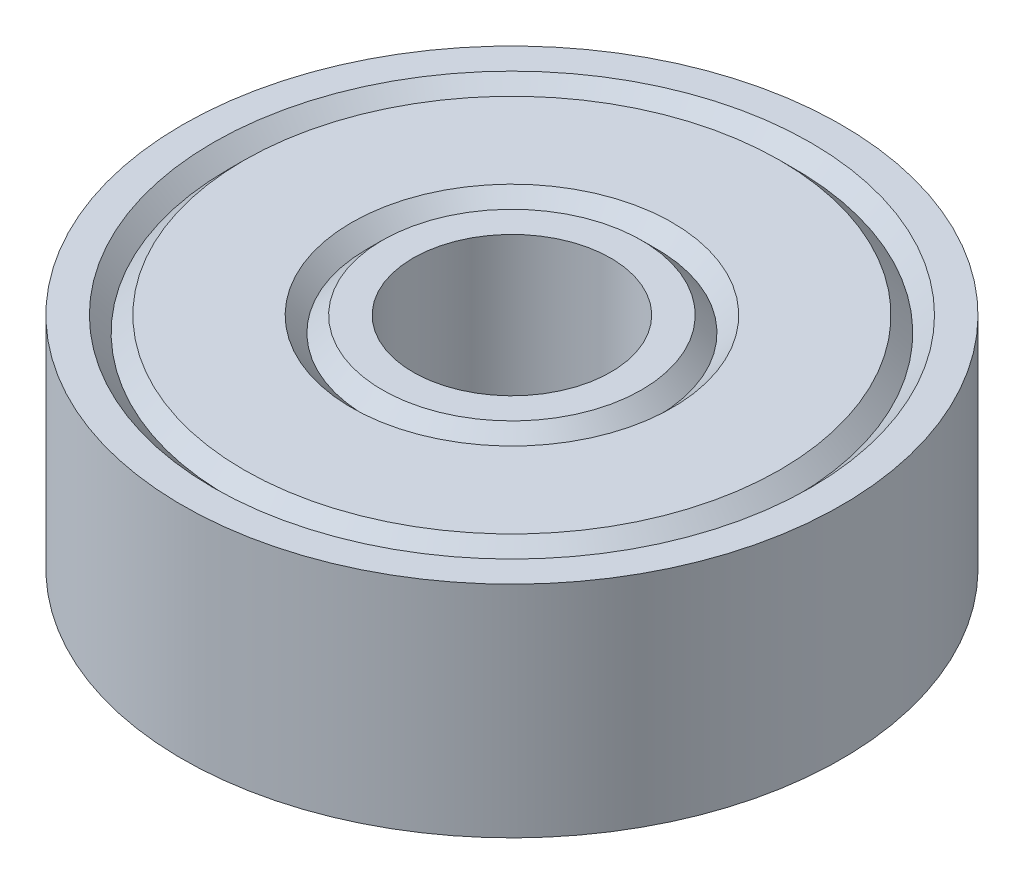
ISO-10303-21;
HEADER;
FILE_DESCRIPTION(('STEP AP214'),'2;1');
FILE_NAME('part.step','',(''),(''),'','','');
FILE_SCHEMA(('AUTOMOTIVE_DESIGN { 1 0 10303 214 1 1 1 1 }'));
ENDSEC;
DATA;
#1=APPLICATION_CONTEXT('core data for automotive mechanical design processes');
#2=APPLICATION_PROTOCOL_DEFINITION('international standard','automotive_design',2000,#1);
#3=PRODUCT_CONTEXT('',#1,'mechanical');
#4=PRODUCT('Part','Part','',(#3));
#5=PRODUCT_RELATED_PRODUCT_CATEGORY('part','',(#4));
#6=PRODUCT_DEFINITION_FORMATION('','',#4);
#7=PRODUCT_DEFINITION_CONTEXT('part definition',#1,'design');
#8=PRODUCT_DEFINITION('design','',#6,#7);
#9=PRODUCT_DEFINITION_SHAPE('','',#8);
#10=(LENGTH_UNIT() NAMED_UNIT(*) SI_UNIT(.MILLI.,.METRE.));
#11=(NAMED_UNIT(*) PLANE_ANGLE_UNIT() SI_UNIT($,.RADIAN.));
#12=(NAMED_UNIT(*) SI_UNIT($,.STERADIAN.) SOLID_ANGLE_UNIT());
#13=UNCERTAINTY_MEASURE_WITH_UNIT(LENGTH_MEASURE(1.E-05),#10,'distance_accuracy_value','');
#14=(GEOMETRIC_REPRESENTATION_CONTEXT(3) GLOBAL_UNCERTAINTY_ASSIGNED_CONTEXT((#13)) GLOBAL_UNIT_ASSIGNED_CONTEXT((#10,
#11,#12)) REPRESENTATION_CONTEXT('',''));
#15=CARTESIAN_POINT('',(0.,0.,0.));
#16=DIRECTION('',(0.,0.,1.));
#17=DIRECTION('',(1.,0.,0.));
#18=AXIS2_PLACEMENT_3D('',#15,#16,#17);
#19=CARTESIAN_POINT('',(0.,5.,0.));
#20=DIRECTION('',(0.,1.,0.));
#21=DIRECTION('',(-1.,0.,0.));
#22=AXIS2_PLACEMENT_3D('',#19,#20,#21);
#23=CYLINDRICAL_SURFACE('',#22,4.5);
#24=CARTESIAN_POINT('',(0.,5.00000000000001,0.));
#25=DIRECTION('',(0.,1.,0.));
#26=DIRECTION('',(-1.,0.,0.));
#27=AXIS2_PLACEMENT_3D('',#24,#25,#26);
#28=CIRCLE('',#27,4.5);
#29=CARTESIAN_POINT('',(-4.5,5.00000000000001,0.));
#30=VERTEX_POINT('',#29);
#31=EDGE_CURVE('E83',#30,#30,#28,.T.);
#32=ORIENTED_EDGE('',*,*,#31,.T.);
#33=EDGE_LOOP('',(#32));
#34=FACE_BOUND('',#33,.T.);
#35=CARTESIAN_POINT('',(0.,-5.00000000000001,0.));
#36=DIRECTION('',(0.,1.,0.));
#37=DIRECTION('',(-1.,0.,0.));
#38=AXIS2_PLACEMENT_3D('',#35,#36,#37);
#39=CIRCLE('',#38,4.5);
#40=CARTESIAN_POINT('',(-4.5,-5.00000000000001,0.));
#41=VERTEX_POINT('',#40);
#42=EDGE_CURVE('E10',#41,#41,#39,.T.);
#43=ORIENTED_EDGE('',*,*,#42,.F.);
#44=EDGE_LOOP('',(#43));
#45=FACE_BOUND('',#44,.T.);
#46=ADVANCED_FACE('F31',(#34,#45),#23,.F.);
#47=CARTESIAN_POINT('',(-4.5,-5.,0.));
#48=DIRECTION('',(0.,-1.,0.));
#49=DIRECTION('',(1.,0.,0.));
#50=AXIS2_PLACEMENT_3D('',#47,#48,#49);
#51=PLANE('',#50);
#52=ORIENTED_EDGE('',*,*,#42,.T.);
#53=EDGE_LOOP('',(#52));
#54=FACE_BOUND('',#53,.T.);
#55=CARTESIAN_POINT('',(0.,-5.,0.));
#56=DIRECTION('',(0.,1.,0.));
#57=DIRECTION('',(-1.,0.,0.));
#58=AXIS2_PLACEMENT_3D('',#55,#56,#57);
#59=CIRCLE('',#58,5.9);
#60=CARTESIAN_POINT('',(-5.9,-5.,0.));
#61=VERTEX_POINT('',#60);
#62=EDGE_CURVE('E37',#61,#61,#59,.T.);
#63=ORIENTED_EDGE('',*,*,#62,.F.);
#64=EDGE_LOOP('',(#63));
#65=FACE_BOUND('',#64,.T.);
#66=ADVANCED_FACE('F101',(#54,#65),#51,.T.);
#67=CARTESIAN_POINT('',(0.,-4.3,0.));
#68=DIRECTION('',(0.,1.,0.));
#69=DIRECTION('',(-1.,0.,0.));
#70=AXIS2_PLACEMENT_3D('',#67,#68,#69);
#71=CONICAL_SURFACE('',#70,6.59999999999999,0.78539816339745);
#72=ORIENTED_EDGE('',*,*,#62,.T.);
#73=EDGE_LOOP('',(#72));
#74=FACE_BOUND('',#73,.T.);
#75=CARTESIAN_POINT('',(0.,-4.3,0.));
#76=DIRECTION('',(0.,1.,0.));
#77=DIRECTION('',(-1.,0.,0.));
#78=AXIS2_PLACEMENT_3D('',#75,#76,#77);
#79=CIRCLE('',#78,6.59999999999999);
#80=CARTESIAN_POINT('',(-6.59999999999999,-4.3,0.));
#81=VERTEX_POINT('',#80);
#82=EDGE_CURVE('E41',#81,#81,#79,.T.);
#83=ORIENTED_EDGE('',*,*,#82,.F.);
#84=EDGE_LOOP('',(#83));
#85=FACE_BOUND('',#84,.T.);
#86=ADVANCED_FACE('F105',(#74,#85),#71,.T.);
#87=CARTESIAN_POINT('',(0.,-5.,0.));
#88=DIRECTION('',(0.,-1.,0.));
#89=DIRECTION('',(1.,0.,0.));
#90=AXIS2_PLACEMENT_3D('',#87,#88,#89);
#91=CONICAL_SURFACE('',#90,7.29999999999999,0.785398163397449);
#92=ORIENTED_EDGE('',*,*,#82,.T.);
#93=EDGE_LOOP('',(#92));
#94=FACE_BOUND('',#93,.T.);
#95=CARTESIAN_POINT('',(0.,-5.,0.));
#96=DIRECTION('',(0.,1.,0.));
#97=DIRECTION('',(-1.,0.,0.));
#98=AXIS2_PLACEMENT_3D('',#95,#96,#97);
#99=CIRCLE('',#98,7.29999999999999);
#100=CARTESIAN_POINT('',(-7.29999999999999,-5.,0.));
#101=VERTEX_POINT('',#100);
#102=EDGE_CURVE('E45',#101,#101,#99,.T.);
#103=ORIENTED_EDGE('',*,*,#102,.F.);
#104=EDGE_LOOP('',(#103));
#105=FACE_BOUND('',#104,.T.);
#106=ADVANCED_FACE('F109',(#94,#105),#91,.F.);
#107=CARTESIAN_POINT('',(-7.29999999999999,-5.,0.));
#108=DIRECTION('',(0.,-1.,0.));
#109=DIRECTION('',(1.,0.,0.));
#110=AXIS2_PLACEMENT_3D('',#107,#108,#109);
#111=PLANE('',#110);
#112=ORIENTED_EDGE('',*,*,#102,.T.);
#113=EDGE_LOOP('',(#112));
#114=FACE_BOUND('',#113,.T.);
#115=CARTESIAN_POINT('',(0.,-5.,0.));
#116=DIRECTION('',(0.,1.,0.));
#117=DIRECTION('',(-1.,0.,0.));
#118=AXIS2_PLACEMENT_3D('',#115,#116,#117);
#119=CIRCLE('',#118,12.2);
#120=CARTESIAN_POINT('',(-12.2,-5.,0.));
#121=VERTEX_POINT('',#120);
#122=EDGE_CURVE('E50',#121,#121,#119,.T.);
#123=ORIENTED_EDGE('',*,*,#122,.F.);
#124=EDGE_LOOP('',(#123));
#125=FACE_BOUND('',#124,.T.);
#126=ADVANCED_FACE('F115',(#114,#125),#111,.T.);
#127=CARTESIAN_POINT('',(0.,-4.3,0.));
#128=DIRECTION('',(0.,1.,0.));
#129=DIRECTION('',(-1.,0.,0.));
#130=AXIS2_PLACEMENT_3D('',#127,#128,#129);
#131=CONICAL_SURFACE('',#130,12.9,0.785398163397448);
#132=ORIENTED_EDGE('',*,*,#122,.T.);
#133=EDGE_LOOP('',(#132));
#134=FACE_BOUND('',#133,.T.);
#135=CARTESIAN_POINT('',(0.,-4.3,0.));
#136=DIRECTION('',(0.,1.,0.));
#137=DIRECTION('',(-1.,0.,0.));
#138=AXIS2_PLACEMENT_3D('',#135,#136,#137);
#139=CIRCLE('',#138,12.9);
#140=CARTESIAN_POINT('',(-12.9,-4.3,0.));
#141=VERTEX_POINT('',#140);
#142=EDGE_CURVE('E53',#141,#141,#139,.T.);
#143=ORIENTED_EDGE('',*,*,#142,.F.);
#144=EDGE_LOOP('',(#143));
#145=FACE_BOUND('',#144,.T.);
#146=ADVANCED_FACE('F119',(#134,#145),#131,.T.);
#147=CARTESIAN_POINT('',(0.,-5.,0.));
#148=DIRECTION('',(0.,-1.,0.));
#149=DIRECTION('',(1.,0.,0.));
#150=AXIS2_PLACEMENT_3D('',#147,#148,#149);
#151=CONICAL_SURFACE('',#150,13.6,0.785398163397445);
#152=ORIENTED_EDGE('',*,*,#142,.T.);
#153=EDGE_LOOP('',(#152));
#154=FACE_BOUND('',#153,.T.);
#155=CARTESIAN_POINT('',(0.,-5.,0.));
#156=DIRECTION('',(0.,1.,0.));
#157=DIRECTION('',(-1.,0.,0.));
#158=AXIS2_PLACEMENT_3D('',#155,#156,#157);
#159=CIRCLE('',#158,13.6);
#160=CARTESIAN_POINT('',(-13.6,-5.,0.));
#161=VERTEX_POINT('',#160);
#162=EDGE_CURVE('E56',#161,#161,#159,.T.);
#163=ORIENTED_EDGE('',*,*,#162,.F.);
#164=EDGE_LOOP('',(#163));
#165=FACE_BOUND('',#164,.T.);
#166=ADVANCED_FACE('F123',(#154,#165),#151,.F.);
#167=CARTESIAN_POINT('',(-13.6,-5.,0.));
#168=DIRECTION('',(0.,-1.,0.));
#169=DIRECTION('',(1.,0.,0.));
#170=AXIS2_PLACEMENT_3D('',#167,#168,#169);
#171=PLANE('',#170);
#172=ORIENTED_EDGE('',*,*,#162,.T.);
#173=EDGE_LOOP('',(#172));
#174=FACE_BOUND('',#173,.T.);
#175=CARTESIAN_POINT('',(0.,-5.,0.));
#176=DIRECTION('',(0.,1.,0.));
#177=DIRECTION('',(-1.,0.,0.));
#178=AXIS2_PLACEMENT_3D('',#175,#176,#177);
#179=CIRCLE('',#178,15.);
#180=CARTESIAN_POINT('',(-15.,-5.,0.));
#181=VERTEX_POINT('',#180);
#182=EDGE_CURVE('E59',#181,#181,#179,.T.);
#183=ORIENTED_EDGE('',*,*,#182,.F.);
#184=EDGE_LOOP('',(#183));
#185=FACE_BOUND('',#184,.T.);
#186=ADVANCED_FACE('F127',(#174,#185),#171,.T.);
#187=CARTESIAN_POINT('',(0.,5.,0.));
#188=DIRECTION('',(0.,1.,0.));
#189=DIRECTION('',(-1.,0.,0.));
#190=AXIS2_PLACEMENT_3D('',#187,#188,#189);
#191=CYLINDRICAL_SURFACE('',#190,15.);
#192=ORIENTED_EDGE('',*,*,#182,.T.);
#193=EDGE_LOOP('',(#192));
#194=FACE_BOUND('',#193,.T.);
#195=CARTESIAN_POINT('',(0.,5.,0.));
#196=DIRECTION('',(0.,1.,0.));
#197=DIRECTION('',(-1.,0.,0.));
#198=AXIS2_PLACEMENT_3D('',#195,#196,#197);
#199=CIRCLE('',#198,15.);
#200=CARTESIAN_POINT('',(-15.,5.,0.));
#201=VERTEX_POINT('',#200);
#202=EDGE_CURVE('E62',#201,#201,#199,.T.);
#203=ORIENTED_EDGE('',*,*,#202,.F.);
#204=EDGE_LOOP('',(#203));
#205=FACE_BOUND('',#204,.T.);
#206=ADVANCED_FACE('F131',(#194,#205),#191,.T.);
#207=CARTESIAN_POINT('',(-13.6,5.,0.));
#208=DIRECTION('',(0.,1.,0.));
#209=DIRECTION('',(-1.,0.,0.));
#210=AXIS2_PLACEMENT_3D('',#207,#208,#209);
#211=PLANE('',#210);
#212=ORIENTED_EDGE('',*,*,#202,.T.);
#213=EDGE_LOOP('',(#212));
#214=FACE_BOUND('',#213,.T.);
#215=CARTESIAN_POINT('',(0.,5.,0.));
#216=DIRECTION('',(0.,1.,0.));
#217=DIRECTION('',(-1.,0.,0.));
#218=AXIS2_PLACEMENT_3D('',#215,#216,#217);
#219=CIRCLE('',#218,13.6);
#220=CARTESIAN_POINT('',(-13.6,5.,0.));
#221=VERTEX_POINT('',#220);
#222=EDGE_CURVE('E65',#221,#221,#219,.T.);
#223=ORIENTED_EDGE('',*,*,#222,.F.);
#224=EDGE_LOOP('',(#223));
#225=FACE_BOUND('',#224,.T.);
#226=ADVANCED_FACE('F135',(#214,#225),#211,.T.);
#227=CARTESIAN_POINT('',(0.,4.3,0.));
#228=DIRECTION('',(0.,1.,0.));
#229=DIRECTION('',(-1.,0.,0.));
#230=AXIS2_PLACEMENT_3D('',#227,#228,#229);
#231=CONICAL_SURFACE('',#230,12.9,0.785398163397445);
#232=ORIENTED_EDGE('',*,*,#222,.T.);
#233=EDGE_LOOP('',(#232));
#234=FACE_BOUND('',#233,.T.);
#235=CARTESIAN_POINT('',(0.,4.3,0.));
#236=DIRECTION('',(0.,1.,0.));
#237=DIRECTION('',(-1.,0.,0.));
#238=AXIS2_PLACEMENT_3D('',#235,#236,#237);
#239=CIRCLE('',#238,12.9);
#240=CARTESIAN_POINT('',(-12.9,4.3,0.));
#241=VERTEX_POINT('',#240);
#242=EDGE_CURVE('E68',#241,#241,#239,.T.);
#243=ORIENTED_EDGE('',*,*,#242,.F.);
#244=EDGE_LOOP('',(#243));
#245=FACE_BOUND('',#244,.T.);
#246=ADVANCED_FACE('F139',(#234,#245),#231,.F.);
#247=CARTESIAN_POINT('',(0.,5.,0.));
#248=DIRECTION('',(0.,-1.,0.));
#249=DIRECTION('',(1.,0.,0.));
#250=AXIS2_PLACEMENT_3D('',#247,#248,#249);
#251=CONICAL_SURFACE('',#250,12.2,0.785398163397448);
#252=ORIENTED_EDGE('',*,*,#242,.T.);
#253=EDGE_LOOP('',(#252));
#254=FACE_BOUND('',#253,.T.);
#255=CARTESIAN_POINT('',(0.,5.,0.));
#256=DIRECTION('',(0.,1.,0.));
#257=DIRECTION('',(-1.,0.,0.));
#258=AXIS2_PLACEMENT_3D('',#255,#256,#257);
#259=CIRCLE('',#258,12.2);
#260=CARTESIAN_POINT('',(-12.2,5.,0.));
#261=VERTEX_POINT('',#260);
#262=EDGE_CURVE('E71',#261,#261,#259,.T.);
#263=ORIENTED_EDGE('',*,*,#262,.F.);
#264=EDGE_LOOP('',(#263));
#265=FACE_BOUND('',#264,.T.);
#266=ADVANCED_FACE('F143',(#254,#265),#251,.T.);
#267=CARTESIAN_POINT('',(-7.29999999999999,5.,0.));
#268=DIRECTION('',(0.,1.,0.));
#269=DIRECTION('',(-1.,0.,0.));
#270=AXIS2_PLACEMENT_3D('',#267,#268,#269);
#271=PLANE('',#270);
#272=ORIENTED_EDGE('',*,*,#262,.T.);
#273=EDGE_LOOP('',(#272));
#274=FACE_BOUND('',#273,.T.);
#275=CARTESIAN_POINT('',(0.,5.,0.));
#276=DIRECTION('',(0.,1.,0.));
#277=DIRECTION('',(-1.,0.,0.));
#278=AXIS2_PLACEMENT_3D('',#275,#276,#277);
#279=CIRCLE('',#278,7.29999999999999);
#280=CARTESIAN_POINT('',(-7.29999999999999,5.,0.));
#281=VERTEX_POINT('',#280);
#282=EDGE_CURVE('E74',#281,#281,#279,.T.);
#283=ORIENTED_EDGE('',*,*,#282,.F.);
#284=EDGE_LOOP('',(#283));
#285=FACE_BOUND('',#284,.T.);
#286=ADVANCED_FACE('F147',(#274,#285),#271,.T.);
#287=CARTESIAN_POINT('',(0.,4.3,0.));
#288=DIRECTION('',(0.,1.,0.));
#289=DIRECTION('',(-1.,0.,0.));
#290=AXIS2_PLACEMENT_3D('',#287,#288,#289);
#291=CONICAL_SURFACE('',#290,6.59999999999999,0.785398163397449);
#292=ORIENTED_EDGE('',*,*,#282,.T.);
#293=EDGE_LOOP('',(#292));
#294=FACE_BOUND('',#293,.T.);
#295=CARTESIAN_POINT('',(0.,4.3,0.));
#296=DIRECTION('',(0.,1.,0.));
#297=DIRECTION('',(-1.,0.,0.));
#298=AXIS2_PLACEMENT_3D('',#295,#296,#297);
#299=CIRCLE('',#298,6.59999999999999);
#300=CARTESIAN_POINT('',(-6.59999999999999,4.3,0.));
#301=VERTEX_POINT('',#300);
#302=EDGE_CURVE('E77',#301,#301,#299,.T.);
#303=ORIENTED_EDGE('',*,*,#302,.F.);
#304=EDGE_LOOP('',(#303));
#305=FACE_BOUND('',#304,.T.);
#306=ADVANCED_FACE('F97',(#294,#305),#291,.F.);
#307=CARTESIAN_POINT('',(0.,5.,0.));
#308=DIRECTION('',(0.,-1.,0.));
#309=DIRECTION('',(1.,0.,0.));
#310=AXIS2_PLACEMENT_3D('',#307,#308,#309);
#311=CONICAL_SURFACE('',#310,5.9,0.785398163397447);
#312=ORIENTED_EDGE('',*,*,#302,.T.);
#313=EDGE_LOOP('',(#312));
#314=FACE_BOUND('',#313,.T.);
#315=CARTESIAN_POINT('',(0.,5.,0.));
#316=DIRECTION('',(0.,1.,0.));
#317=DIRECTION('',(-1.,0.,0.));
#318=AXIS2_PLACEMENT_3D('',#315,#316,#317);
#319=CIRCLE('',#318,5.9);
#320=CARTESIAN_POINT('',(-5.9,5.,0.));
#321=VERTEX_POINT('',#320);
#322=EDGE_CURVE('E80',#321,#321,#319,.T.);
#323=ORIENTED_EDGE('',*,*,#322,.F.);
#324=EDGE_LOOP('',(#323));
#325=FACE_BOUND('',#324,.T.);
#326=ADVANCED_FACE('F91',(#314,#325),#311,.T.);
#327=CARTESIAN_POINT('',(-4.5,5.,0.));
#328=DIRECTION('',(0.,1.,0.));
#329=DIRECTION('',(-1.,0.,0.));
#330=AXIS2_PLACEMENT_3D('',#327,#328,#329);
#331=PLANE('',#330);
#332=ORIENTED_EDGE('',*,*,#322,.T.);
#333=EDGE_LOOP('',(#332));
#334=FACE_BOUND('',#333,.T.);
#335=ORIENTED_EDGE('',*,*,#31,.F.);
#336=EDGE_LOOP('',(#335));
#337=FACE_BOUND('',#336,.T.);
#338=ADVANCED_FACE('F89',(#334,#337),#331,.T.);
#339=CLOSED_SHELL('',(#46,#66,#86,#106,#126,#146,#166,#186,#206,#226,#246,#266,#286,#306,#326,#338));
#340=MANIFOLD_SOLID_BREP('B2',#339);
#341=ADVANCED_BREP_SHAPE_REPRESENTATION('',(#18,#340),#14);
#342=SHAPE_DEFINITION_REPRESENTATION(#9,#341);
ENDSEC;
END-ISO-10303-21;
